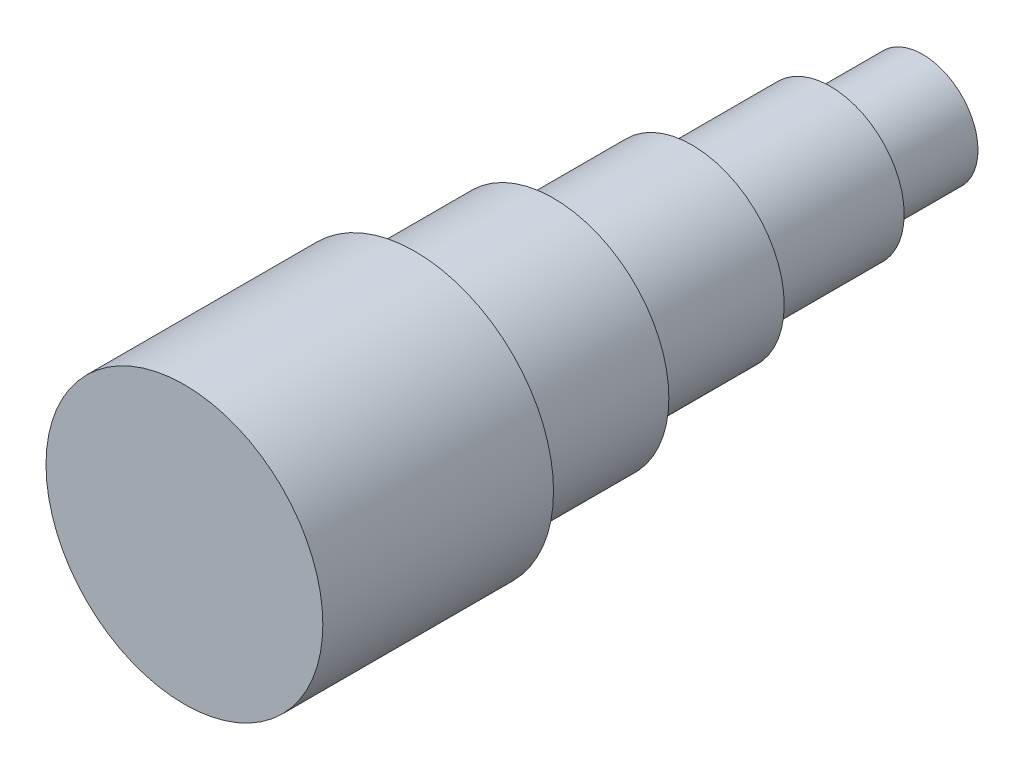
ISO-10303-21;
HEADER;
FILE_DESCRIPTION(('STEP AP214'),'2;1');
FILE_NAME('part.step','',(''),(''),'','','');
FILE_SCHEMA(('AUTOMOTIVE_DESIGN { 1 0 10303 214 1 1 1 1 }'));
ENDSEC;
DATA;
#1=APPLICATION_CONTEXT('core data for automotive mechanical design processes');
#2=APPLICATION_PROTOCOL_DEFINITION('international standard','automotive_design',2000,#1);
#3=PRODUCT_CONTEXT('',#1,'mechanical');
#4=PRODUCT('Part','Part','',(#3));
#5=PRODUCT_RELATED_PRODUCT_CATEGORY('part','',(#4));
#6=PRODUCT_DEFINITION_FORMATION('','',#4);
#7=PRODUCT_DEFINITION_CONTEXT('part definition',#1,'design');
#8=PRODUCT_DEFINITION('design','',#6,#7);
#9=PRODUCT_DEFINITION_SHAPE('','',#8);
#10=(LENGTH_UNIT() NAMED_UNIT(*) SI_UNIT(.MILLI.,.METRE.));
#11=(NAMED_UNIT(*) PLANE_ANGLE_UNIT() SI_UNIT($,.RADIAN.));
#12=(NAMED_UNIT(*) SI_UNIT($,.STERADIAN.) SOLID_ANGLE_UNIT());
#13=UNCERTAINTY_MEASURE_WITH_UNIT(LENGTH_MEASURE(1.E-05),#10,'distance_accuracy_value','');
#14=(GEOMETRIC_REPRESENTATION_CONTEXT(3) GLOBAL_UNCERTAINTY_ASSIGNED_CONTEXT((#13)) GLOBAL_UNIT_ASSIGNED_CONTEXT((#10,
#11,#12)) REPRESENTATION_CONTEXT('',''));
#15=CARTESIAN_POINT('',(0.,0.,0.));
#16=DIRECTION('',(0.,0.,1.));
#17=DIRECTION('',(1.,0.,0.));
#18=AXIS2_PLACEMENT_3D('',#15,#16,#17);
#19=CARTESIAN_POINT('',(0.,0.,1328.27668654286));
#20=DIRECTION('',(0.,0.,1.));
#21=DIRECTION('',(1.,0.,0.));
#22=AXIS2_PLACEMENT_3D('',#19,#20,#21);
#23=CYLINDRICAL_SURFACE('',#22,8.);
#24=CARTESIAN_POINT('',(0.,0.,-70.0000000000001));
#25=DIRECTION('',(0.,0.,1.));
#26=DIRECTION('',(1.,0.,0.));
#27=AXIS2_PLACEMENT_3D('',#24,#25,#26);
#28=CIRCLE('',#27,8.);
#29=CARTESIAN_POINT('',(8.,0.,-70.0000000000001));
#30=VERTEX_POINT('',#29);
#31=EDGE_CURVE('E64',#30,#30,#28,.T.);
#32=ORIENTED_EDGE('',*,*,#31,.T.);
#33=EDGE_LOOP('',(#32));
#34=FACE_BOUND('',#33,.T.);
#35=CARTESIAN_POINT('',(0.,0.,-54.9999999999999));
#36=DIRECTION('',(0.,0.,1.));
#37=DIRECTION('',(1.,0.,0.));
#38=AXIS2_PLACEMENT_3D('',#35,#36,#37);
#39=CIRCLE('',#38,8.);
#40=CARTESIAN_POINT('',(8.,0.,-54.9999999999999));
#41=VERTEX_POINT('',#40);
#42=EDGE_CURVE('E10',#41,#41,#39,.T.);
#43=ORIENTED_EDGE('',*,*,#42,.F.);
#44=EDGE_LOOP('',(#43));
#45=FACE_BOUND('',#44,.T.);
#46=ADVANCED_FACE('F30',(#34,#45),#23,.T.);
#47=CARTESIAN_POINT('',(0.,0.,-55.));
#48=DIRECTION('',(0.,0.,-1.));
#49=DIRECTION('',(-1.,0.,0.));
#50=AXIS2_PLACEMENT_3D('',#47,#48,#49);
#51=PLANE('',#50);
#52=ORIENTED_EDGE('',*,*,#42,.T.);
#53=EDGE_LOOP('',(#52));
#54=FACE_BOUND('',#53,.T.);
#55=CARTESIAN_POINT('',(0.,0.,-54.9999999999999));
#56=DIRECTION('',(0.,0.,1.));
#57=DIRECTION('',(1.,0.,0.));
#58=AXIS2_PLACEMENT_3D('',#55,#56,#57);
#59=CIRCLE('',#58,10.);
#60=CARTESIAN_POINT('',(10.,0.,-54.9999999999999));
#61=VERTEX_POINT('',#60);
#62=EDGE_CURVE('E36',#61,#61,#59,.T.);
#63=ORIENTED_EDGE('',*,*,#62,.F.);
#64=EDGE_LOOP('',(#63));
#65=FACE_BOUND('',#64,.T.);
#66=ADVANCED_FACE('F82',(#54,#65),#51,.T.);
#67=CARTESIAN_POINT('',(0.,0.,1328.27668654286));
#68=DIRECTION('',(0.,0.,1.));
#69=DIRECTION('',(1.,0.,0.));
#70=AXIS2_PLACEMENT_3D('',#67,#68,#69);
#71=CYLINDRICAL_SURFACE('',#70,10.);
#72=ORIENTED_EDGE('',*,*,#62,.T.);
#73=EDGE_LOOP('',(#72));
#74=FACE_BOUND('',#73,.T.);
#75=CARTESIAN_POINT('',(0.,0.,-40.));
#76=DIRECTION('',(0.,0.,1.));
#77=DIRECTION('',(1.,0.,0.));
#78=AXIS2_PLACEMENT_3D('',#75,#76,#77);
#79=CIRCLE('',#78,10.);
#80=CARTESIAN_POINT('',(10.,0.,-40.));
#81=VERTEX_POINT('',#80);
#82=EDGE_CURVE('E40',#81,#81,#79,.T.);
#83=ORIENTED_EDGE('',*,*,#82,.F.);
#84=EDGE_LOOP('',(#83));
#85=FACE_BOUND('',#84,.T.);
#86=ADVANCED_FACE('F86',(#74,#85),#71,.T.);
#87=CARTESIAN_POINT('',(0.,0.,-40.));
#88=DIRECTION('',(0.,0.,-1.));
#89=DIRECTION('',(-1.,0.,0.));
#90=AXIS2_PLACEMENT_3D('',#87,#88,#89);
#91=PLANE('',#90);
#92=ORIENTED_EDGE('',*,*,#82,.T.);
#93=EDGE_LOOP('',(#92));
#94=FACE_BOUND('',#93,.T.);
#95=CARTESIAN_POINT('',(0.,0.,-40.));
#96=DIRECTION('',(0.,0.,1.));
#97=DIRECTION('',(1.,0.,0.));
#98=AXIS2_PLACEMENT_3D('',#95,#96,#97);
#99=CIRCLE('',#98,12.5);
#100=CARTESIAN_POINT('',(12.5,0.,-40.));
#101=VERTEX_POINT('',#100);
#102=EDGE_CURVE('E44',#101,#101,#99,.T.);
#103=ORIENTED_EDGE('',*,*,#102,.F.);
#104=EDGE_LOOP('',(#103));
#105=FACE_BOUND('',#104,.T.);
#106=ADVANCED_FACE('F90',(#94,#105),#91,.T.);
#107=CARTESIAN_POINT('',(0.,0.,1328.27668654286));
#108=DIRECTION('',(0.,0.,1.));
#109=DIRECTION('',(1.,0.,0.));
#110=AXIS2_PLACEMENT_3D('',#107,#108,#109);
#111=CYLINDRICAL_SURFACE('',#110,12.5);
#112=ORIENTED_EDGE('',*,*,#102,.T.);
#113=EDGE_LOOP('',(#112));
#114=FACE_BOUND('',#113,.T.);
#115=CARTESIAN_POINT('',(0.,0.,-24.9999999999999));
#116=DIRECTION('',(0.,0.,1.));
#117=DIRECTION('',(1.,0.,0.));
#118=AXIS2_PLACEMENT_3D('',#115,#116,#117);
#119=CIRCLE('',#118,12.5);
#120=CARTESIAN_POINT('',(12.5,0.,-24.9999999999999));
#121=VERTEX_POINT('',#120);
#122=EDGE_CURVE('E49',#121,#121,#119,.T.);
#123=ORIENTED_EDGE('',*,*,#122,.F.);
#124=EDGE_LOOP('',(#123));
#125=FACE_BOUND('',#124,.T.);
#126=ADVANCED_FACE('F96',(#114,#125),#111,.T.);
#127=CARTESIAN_POINT('',(0.,0.,-25.));
#128=DIRECTION('',(0.,0.,-1.));
#129=DIRECTION('',(-1.,0.,0.));
#130=AXIS2_PLACEMENT_3D('',#127,#128,#129);
#131=PLANE('',#130);
#132=ORIENTED_EDGE('',*,*,#122,.T.);
#133=EDGE_LOOP('',(#132));
#134=FACE_BOUND('',#133,.T.);
#135=CARTESIAN_POINT('',(0.,0.,-24.9999999999999));
#136=DIRECTION('',(0.,0.,1.));
#137=DIRECTION('',(1.,0.,0.));
#138=AXIS2_PLACEMENT_3D('',#135,#136,#137);
#139=CIRCLE('',#138,15.);
#140=CARTESIAN_POINT('',(15.,0.,-24.9999999999999));
#141=VERTEX_POINT('',#140);
#142=EDGE_CURVE('E52',#141,#141,#139,.T.);
#143=ORIENTED_EDGE('',*,*,#142,.F.);
#144=EDGE_LOOP('',(#143));
#145=FACE_BOUND('',#144,.T.);
#146=ADVANCED_FACE('F100',(#134,#145),#131,.T.);
#147=CARTESIAN_POINT('',(0.,0.,1328.27668654286));
#148=DIRECTION('',(0.,0.,1.));
#149=DIRECTION('',(1.,0.,0.));
#150=AXIS2_PLACEMENT_3D('',#147,#148,#149);
#151=CYLINDRICAL_SURFACE('',#150,15.);
#152=ORIENTED_EDGE('',*,*,#142,.T.);
#153=EDGE_LOOP('',(#152));
#154=FACE_BOUND('',#153,.T.);
#155=CARTESIAN_POINT('',(0.,0.,0.));
#156=DIRECTION('',(0.,0.,1.));
#157=DIRECTION('',(1.,0.,0.));
#158=AXIS2_PLACEMENT_3D('',#155,#156,#157);
#159=CIRCLE('',#158,15.);
#160=CARTESIAN_POINT('',(15.,0.,0.));
#161=VERTEX_POINT('',#160);
#162=EDGE_CURVE('E55',#161,#161,#159,.T.);
#163=ORIENTED_EDGE('',*,*,#162,.F.);
#164=EDGE_LOOP('',(#163));
#165=FACE_BOUND('',#164,.T.);
#166=ADVANCED_FACE('F104',(#154,#165),#151,.T.);
#167=CARTESIAN_POINT('',(0.,0.,0.));
#168=DIRECTION('',(0.,0.,1.));
#169=DIRECTION('',(1.,0.,0.));
#170=AXIS2_PLACEMENT_3D('',#167,#168,#169);
#171=PLANE('',#170);
#172=ORIENTED_EDGE('',*,*,#162,.T.);
#173=EDGE_LOOP('',(#172));
#174=FACE_BOUND('',#173,.T.);
#175=ADVANCED_FACE('F108',(#174),#171,.T.);
#176=CARTESIAN_POINT('',(0.,0.,-80.));
#177=DIRECTION('',(0.,0.,-1.));
#178=DIRECTION('',(-1.,0.,0.));
#179=AXIS2_PLACEMENT_3D('',#176,#177,#178);
#180=PLANE('',#179);
#181=CARTESIAN_POINT('',(0.,0.,-80.0000000000001));
#182=DIRECTION('',(0.,0.,1.));
#183=DIRECTION('',(1.,0.,0.));
#184=AXIS2_PLACEMENT_3D('',#181,#182,#183);
#185=CIRCLE('',#184,6.);
#186=CARTESIAN_POINT('',(6.,0.,-80.0000000000001));
#187=VERTEX_POINT('',#186);
#188=EDGE_CURVE('E58',#187,#187,#185,.T.);
#189=ORIENTED_EDGE('',*,*,#188,.F.);
#190=EDGE_LOOP('',(#189));
#191=FACE_BOUND('',#190,.T.);
#192=ADVANCED_FACE('F78',(#191),#180,.T.);
#193=CARTESIAN_POINT('',(0.,0.,1328.27668654286));
#194=DIRECTION('',(0.,0.,1.));
#195=DIRECTION('',(1.,0.,0.));
#196=AXIS2_PLACEMENT_3D('',#193,#194,#195);
#197=CYLINDRICAL_SURFACE('',#196,6.);
#198=ORIENTED_EDGE('',*,*,#188,.T.);
#199=EDGE_LOOP('',(#198));
#200=FACE_BOUND('',#199,.T.);
#201=CARTESIAN_POINT('',(0.,0.,-70.0000000000001));
#202=DIRECTION('',(0.,0.,1.));
#203=DIRECTION('',(1.,0.,0.));
#204=AXIS2_PLACEMENT_3D('',#201,#202,#203);
#205=CIRCLE('',#204,6.);
#206=CARTESIAN_POINT('',(6.,0.,-70.0000000000001));
#207=VERTEX_POINT('',#206);
#208=EDGE_CURVE('E61',#207,#207,#205,.T.);
#209=ORIENTED_EDGE('',*,*,#208,.F.);
#210=EDGE_LOOP('',(#209));
#211=FACE_BOUND('',#210,.T.);
#212=ADVANCED_FACE('F72',(#200,#211),#197,.T.);
#213=CARTESIAN_POINT('',(0.,0.,-70.));
#214=DIRECTION('',(0.,0.,-1.));
#215=DIRECTION('',(-1.,0.,0.));
#216=AXIS2_PLACEMENT_3D('',#213,#214,#215);
#217=PLANE('',#216);
#218=ORIENTED_EDGE('',*,*,#208,.T.);
#219=EDGE_LOOP('',(#218));
#220=FACE_BOUND('',#219,.T.);
#221=ORIENTED_EDGE('',*,*,#31,.F.);
#222=EDGE_LOOP('',(#221));
#223=FACE_BOUND('',#222,.T.);
#224=ADVANCED_FACE('F70',(#220,#223),#217,.T.);
#225=CLOSED_SHELL('',(#46,#66,#86,#106,#126,#146,#166,#175,#192,#212,#224));
#226=MANIFOLD_SOLID_BREP('B2',#225);
#227=ADVANCED_BREP_SHAPE_REPRESENTATION('',(#18,#226),#14);
#228=SHAPE_DEFINITION_REPRESENTATION(#9,#227);
ENDSEC;
END-ISO-10303-21;
